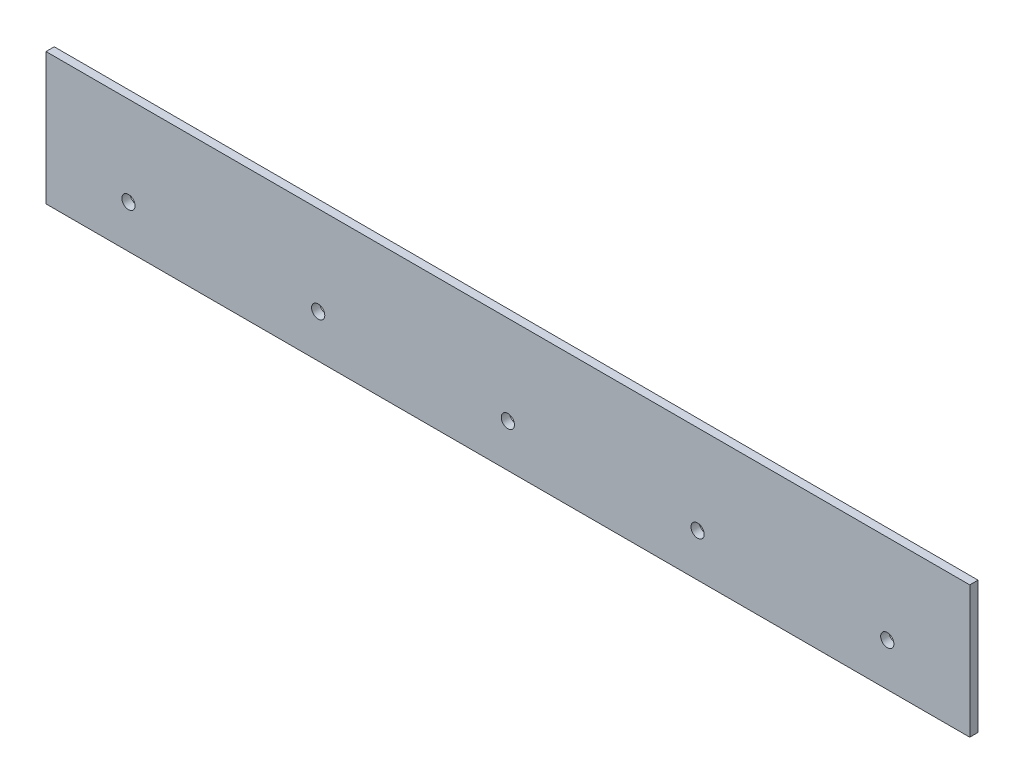
ISO-10303-21;
HEADER;
FILE_DESCRIPTION(('STEP AP214'),'2;1');
FILE_NAME('part.step','',(''),(''),'','','');
FILE_SCHEMA(('AUTOMOTIVE_DESIGN { 1 0 10303 214 1 1 1 1 }'));
ENDSEC;
DATA;
#1=APPLICATION_CONTEXT('core data for automotive mechanical design processes');
#2=APPLICATION_PROTOCOL_DEFINITION('international standard','automotive_design',2000,#1);
#3=PRODUCT_CONTEXT('',#1,'mechanical');
#4=PRODUCT('Part','Part','',(#3));
#5=PRODUCT_RELATED_PRODUCT_CATEGORY('part','',(#4));
#6=PRODUCT_DEFINITION_FORMATION('','',#4);
#7=PRODUCT_DEFINITION_CONTEXT('part definition',#1,'design');
#8=PRODUCT_DEFINITION('design','',#6,#7);
#9=PRODUCT_DEFINITION_SHAPE('','',#8);
#10=(LENGTH_UNIT() NAMED_UNIT(*) SI_UNIT(.MILLI.,.METRE.));
#11=(NAMED_UNIT(*) PLANE_ANGLE_UNIT() SI_UNIT($,.RADIAN.));
#12=(NAMED_UNIT(*) SI_UNIT($,.STERADIAN.) SOLID_ANGLE_UNIT());
#13=UNCERTAINTY_MEASURE_WITH_UNIT(LENGTH_MEASURE(1.E-05),#10,'distance_accuracy_value','');
#14=(GEOMETRIC_REPRESENTATION_CONTEXT(3) GLOBAL_UNCERTAINTY_ASSIGNED_CONTEXT((#13)) GLOBAL_UNIT_ASSIGNED_CONTEXT((#10,
#11,#12)) REPRESENTATION_CONTEXT('',''));
#15=CARTESIAN_POINT('',(0.,0.,0.));
#16=DIRECTION('',(0.,0.,1.));
#17=DIRECTION('',(1.,0.,0.));
#18=AXIS2_PLACEMENT_3D('',#15,#16,#17);
#19=CARTESIAN_POINT('',(0.,0.,3.175));
#20=DIRECTION('',(0.,0.,-1.));
#21=DIRECTION('',(-1.,0.,0.));
#22=AXIS2_PLACEMENT_3D('',#19,#20,#21);
#23=PLANE('',#22);
#24=DIRECTION('',(0.,-1.,0.));
#25=VECTOR('',#24,1.);
#26=CARTESIAN_POINT('',(-177.8,-25.4,3.175));
#27=LINE('',#26,#25);
#28=CARTESIAN_POINT('',(-177.8,25.4,3.175));
#29=VERTEX_POINT('',#28);
#30=CARTESIAN_POINT('',(-177.8,-25.4,3.175));
#31=VERTEX_POINT('',#30);
#32=EDGE_CURVE('E89',#29,#31,#27,.T.);
#33=ORIENTED_EDGE('',*,*,#32,.T.);
#34=DIRECTION('',(1.,0.,0.));
#35=VECTOR('',#34,1.);
#36=CARTESIAN_POINT('',(-177.8,-25.4,3.175));
#37=LINE('',#36,#35);
#38=CARTESIAN_POINT('',(177.8,-25.4,3.175));
#39=VERTEX_POINT('',#38);
#40=EDGE_CURVE('E84',#31,#39,#37,.T.);
#41=ORIENTED_EDGE('',*,*,#40,.T.);
#42=DIRECTION('',(0.,1.,0.));
#43=VECTOR('',#42,1.);
#44=CARTESIAN_POINT('',(177.8,-25.4,3.175));
#45=LINE('',#44,#43);
#46=CARTESIAN_POINT('',(177.8,25.4,3.175));
#47=VERTEX_POINT('',#46);
#48=EDGE_CURVE('E87',#39,#47,#45,.T.);
#49=ORIENTED_EDGE('',*,*,#48,.T.);
#50=DIRECTION('',(-1.,0.,0.));
#51=VECTOR('',#50,1.);
#52=CARTESIAN_POINT('',(-177.8,25.4,3.175));
#53=LINE('',#52,#51);
#54=EDGE_CURVE('E54',#47,#29,#53,.T.);
#55=ORIENTED_EDGE('',*,*,#54,.T.);
#56=EDGE_LOOP('',(#33,#41,#49,#55));
#57=FACE_BOUND('',#56,.T.);
#58=CARTESIAN_POINT('',(0.,-8.89,3.175));
#59=DIRECTION('',(0.,0.,1.));
#60=DIRECTION('',(1.,0.,0.));
#61=AXIS2_PLACEMENT_3D('',#58,#59,#60);
#62=CIRCLE('',#61,2.54);
#63=CARTESIAN_POINT('',(2.54,-8.89,3.175));
#64=VERTEX_POINT('',#63);
#65=EDGE_CURVE('E105',#64,#64,#62,.T.);
#66=ORIENTED_EDGE('',*,*,#65,.F.);
#67=EDGE_LOOP('',(#66));
#68=FACE_BOUND('',#67,.T.);
#69=CARTESIAN_POINT('',(-146.05,-8.89,3.175));
#70=DIRECTION('',(0.,0.,1.));
#71=DIRECTION('',(1.,0.,0.));
#72=AXIS2_PLACEMENT_3D('',#69,#70,#71);
#73=CIRCLE('',#72,2.53999999999998);
#74=CARTESIAN_POINT('',(-143.51,-8.89,3.175));
#75=VERTEX_POINT('',#74);
#76=EDGE_CURVE('E121',#75,#75,#73,.T.);
#77=ORIENTED_EDGE('',*,*,#76,.F.);
#78=EDGE_LOOP('',(#77));
#79=FACE_BOUND('',#78,.T.);
#80=CARTESIAN_POINT('',(-73.025,-8.89,3.175));
#81=DIRECTION('',(0.,0.,1.));
#82=DIRECTION('',(1.,0.,0.));
#83=AXIS2_PLACEMENT_3D('',#80,#81,#82);
#84=CIRCLE('',#83,2.54);
#85=CARTESIAN_POINT('',(-70.485,-8.89,3.175));
#86=VERTEX_POINT('',#85);
#87=EDGE_CURVE('E127',#86,#86,#84,.T.);
#88=ORIENTED_EDGE('',*,*,#87,.F.);
#89=EDGE_LOOP('',(#88));
#90=FACE_BOUND('',#89,.T.);
#91=CARTESIAN_POINT('',(73.025,-8.89,3.175));
#92=DIRECTION('',(0.,0.,1.));
#93=DIRECTION('',(-1.,0.,0.));
#94=AXIS2_PLACEMENT_3D('',#91,#92,#93);
#95=CIRCLE('',#94,2.54);
#96=CARTESIAN_POINT('',(70.485,-8.89,3.175));
#97=VERTEX_POINT('',#96);
#98=EDGE_CURVE('E133',#97,#97,#95,.T.);
#99=ORIENTED_EDGE('',*,*,#98,.F.);
#100=EDGE_LOOP('',(#99));
#101=FACE_BOUND('',#100,.T.);
#102=CARTESIAN_POINT('',(146.05,-8.89,3.175));
#103=DIRECTION('',(0.,0.,1.));
#104=DIRECTION('',(-1.,0.,0.));
#105=AXIS2_PLACEMENT_3D('',#102,#103,#104);
#106=CIRCLE('',#105,2.53999999999998);
#107=CARTESIAN_POINT('',(143.51,-8.89,3.175));
#108=VERTEX_POINT('',#107);
#109=EDGE_CURVE('E139',#108,#108,#106,.T.);
#110=ORIENTED_EDGE('',*,*,#109,.F.);
#111=EDGE_LOOP('',(#110));
#112=FACE_BOUND('',#111,.T.);
#113=ADVANCED_FACE('F37',(#57,#68,#79,#90,#101,#112),#23,.F.);
#114=CARTESIAN_POINT('',(0.,0.,0.));
#115=DIRECTION('',(0.,0.,-1.));
#116=DIRECTION('',(-1.,0.,0.));
#117=AXIS2_PLACEMENT_3D('',#114,#115,#116);
#118=PLANE('',#117);
#119=CARTESIAN_POINT('',(73.025,-8.89,0.));
#120=DIRECTION('',(0.,0.,1.));
#121=DIRECTION('',(-1.,0.,0.));
#122=AXIS2_PLACEMENT_3D('',#119,#120,#121);
#123=CIRCLE('',#122,2.54);
#124=CARTESIAN_POINT('',(70.485,-8.89,0.));
#125=VERTEX_POINT('',#124);
#126=EDGE_CURVE('E136',#125,#125,#123,.T.);
#127=ORIENTED_EDGE('',*,*,#126,.T.);
#128=EDGE_LOOP('',(#127));
#129=FACE_BOUND('',#128,.T.);
#130=CARTESIAN_POINT('',(-146.05,-8.89,0.));
#131=DIRECTION('',(0.,0.,1.));
#132=DIRECTION('',(1.,0.,0.));
#133=AXIS2_PLACEMENT_3D('',#130,#131,#132);
#134=CIRCLE('',#133,2.53999999999998);
#135=CARTESIAN_POINT('',(-143.51,-8.89,0.));
#136=VERTEX_POINT('',#135);
#137=EDGE_CURVE('E124',#136,#136,#134,.T.);
#138=ORIENTED_EDGE('',*,*,#137,.T.);
#139=EDGE_LOOP('',(#138));
#140=FACE_BOUND('',#139,.T.);
#141=DIRECTION('',(0.,-1.,0.));
#142=VECTOR('',#141,1.);
#143=CARTESIAN_POINT('',(-177.8,-25.4,0.));
#144=LINE('',#143,#142);
#145=CARTESIAN_POINT('',(-177.8,25.4,0.));
#146=VERTEX_POINT('',#145);
#147=CARTESIAN_POINT('',(-177.8,-25.4,0.));
#148=VERTEX_POINT('',#147);
#149=EDGE_CURVE('E102',#146,#148,#144,.T.);
#150=ORIENTED_EDGE('',*,*,#149,.F.);
#151=DIRECTION('',(-1.,0.,0.));
#152=VECTOR('',#151,1.);
#153=CARTESIAN_POINT('',(-177.8,25.4,0.));
#154=LINE('',#153,#152);
#155=CARTESIAN_POINT('',(177.8,25.4,0.));
#156=VERTEX_POINT('',#155);
#157=EDGE_CURVE('E77',#156,#146,#154,.T.);
#158=ORIENTED_EDGE('',*,*,#157,.F.);
#159=DIRECTION('',(0.,1.,0.));
#160=VECTOR('',#159,1.);
#161=CARTESIAN_POINT('',(177.8,-25.4,0.));
#162=LINE('',#161,#160);
#163=CARTESIAN_POINT('',(177.8,-25.4,0.));
#164=VERTEX_POINT('',#163);
#165=EDGE_CURVE('E71',#164,#156,#162,.T.);
#166=ORIENTED_EDGE('',*,*,#165,.F.);
#167=DIRECTION('',(1.,0.,0.));
#168=VECTOR('',#167,1.);
#169=CARTESIAN_POINT('',(-177.8,-25.4,0.));
#170=LINE('',#169,#168);
#171=EDGE_CURVE('E93',#148,#164,#170,.T.);
#172=ORIENTED_EDGE('',*,*,#171,.F.);
#173=EDGE_LOOP('',(#150,#158,#166,#172));
#174=FACE_BOUND('',#173,.T.);
#175=CARTESIAN_POINT('',(0.,-8.89,0.));
#176=DIRECTION('',(0.,0.,1.));
#177=DIRECTION('',(1.,0.,0.));
#178=AXIS2_PLACEMENT_3D('',#175,#176,#177);
#179=CIRCLE('',#178,2.54);
#180=CARTESIAN_POINT('',(2.54,-8.89,0.));
#181=VERTEX_POINT('',#180);
#182=EDGE_CURVE('E118',#181,#181,#179,.T.);
#183=ORIENTED_EDGE('',*,*,#182,.T.);
#184=EDGE_LOOP('',(#183));
#185=FACE_BOUND('',#184,.T.);
#186=CARTESIAN_POINT('',(-73.025,-8.89,0.));
#187=DIRECTION('',(0.,0.,1.));
#188=DIRECTION('',(1.,0.,0.));
#189=AXIS2_PLACEMENT_3D('',#186,#187,#188);
#190=CIRCLE('',#189,2.54);
#191=CARTESIAN_POINT('',(-70.485,-8.89,0.));
#192=VERTEX_POINT('',#191);
#193=EDGE_CURVE('E130',#192,#192,#190,.T.);
#194=ORIENTED_EDGE('',*,*,#193,.T.);
#195=EDGE_LOOP('',(#194));
#196=FACE_BOUND('',#195,.T.);
#197=CARTESIAN_POINT('',(146.05,-8.89,0.));
#198=DIRECTION('',(0.,0.,1.));
#199=DIRECTION('',(-1.,0.,0.));
#200=AXIS2_PLACEMENT_3D('',#197,#198,#199);
#201=CIRCLE('',#200,2.53999999999998);
#202=CARTESIAN_POINT('',(143.51,-8.89,0.));
#203=VERTEX_POINT('',#202);
#204=EDGE_CURVE('E142',#203,#203,#201,.T.);
#205=ORIENTED_EDGE('',*,*,#204,.T.);
#206=EDGE_LOOP('',(#205));
#207=FACE_BOUND('',#206,.T.);
#208=ADVANCED_FACE('F114',(#129,#140,#174,#185,#196,#207),#118,.T.);
#209=CARTESIAN_POINT('',(-177.8,-25.4,3.175));
#210=DIRECTION('',(1.,0.,0.));
#211=DIRECTION('',(0.,0.,-1.));
#212=AXIS2_PLACEMENT_3D('',#209,#210,#211);
#213=PLANE('',#212);
#214=ORIENTED_EDGE('',*,*,#149,.T.);
#215=DIRECTION('',(0.,0.,-1.));
#216=VECTOR('',#215,1.);
#217=CARTESIAN_POINT('',(-177.8,-25.4,3.175));
#218=LINE('',#217,#216);
#219=EDGE_CURVE('E11',#31,#148,#218,.T.);
#220=ORIENTED_EDGE('',*,*,#219,.F.);
#221=ORIENTED_EDGE('',*,*,#32,.F.);
#222=DIRECTION('',(0.,0.,-1.));
#223=VECTOR('',#222,1.);
#224=CARTESIAN_POINT('',(-177.8,25.4,3.175));
#225=LINE('',#224,#223);
#226=EDGE_CURVE('E98',#29,#146,#225,.T.);
#227=ORIENTED_EDGE('',*,*,#226,.T.);
#228=EDGE_LOOP('',(#214,#220,#221,#227));
#229=FACE_BOUND('',#228,.T.);
#230=ADVANCED_FACE('F39',(#229),#213,.F.);
#231=CARTESIAN_POINT('',(-177.8,-25.4,3.175));
#232=DIRECTION('',(0.,1.,0.));
#233=DIRECTION('',(0.,0.,1.));
#234=AXIS2_PLACEMENT_3D('',#231,#232,#233);
#235=PLANE('',#234);
#236=ORIENTED_EDGE('',*,*,#171,.T.);
#237=DIRECTION('',(0.,0.,-1.));
#238=VECTOR('',#237,1.);
#239=CARTESIAN_POINT('',(177.8,-25.4,3.175));
#240=LINE('',#239,#238);
#241=EDGE_CURVE('E46',#39,#164,#240,.T.);
#242=ORIENTED_EDGE('',*,*,#241,.F.);
#243=ORIENTED_EDGE('',*,*,#40,.F.);
#244=ORIENTED_EDGE('',*,*,#219,.T.);
#245=EDGE_LOOP('',(#236,#242,#243,#244));
#246=FACE_BOUND('',#245,.T.);
#247=ADVANCED_FACE('F92',(#246),#235,.F.);
#248=CARTESIAN_POINT('',(177.8,-25.4,3.175));
#249=DIRECTION('',(-1.,0.,0.));
#250=DIRECTION('',(0.,0.,1.));
#251=AXIS2_PLACEMENT_3D('',#248,#249,#250);
#252=PLANE('',#251);
#253=ORIENTED_EDGE('',*,*,#165,.T.);
#254=DIRECTION('',(0.,0.,-1.));
#255=VECTOR('',#254,1.);
#256=CARTESIAN_POINT('',(177.8,25.4,3.175));
#257=LINE('',#256,#255);
#258=EDGE_CURVE('E94',#47,#156,#257,.T.);
#259=ORIENTED_EDGE('',*,*,#258,.F.);
#260=ORIENTED_EDGE('',*,*,#48,.F.);
#261=ORIENTED_EDGE('',*,*,#241,.T.);
#262=EDGE_LOOP('',(#253,#259,#260,#261));
#263=FACE_BOUND('',#262,.T.);
#264=ADVANCED_FACE('F95',(#263),#252,.F.);
#265=CARTESIAN_POINT('',(-177.8,25.4,3.175));
#266=DIRECTION('',(0.,-1.,0.));
#267=DIRECTION('',(0.,0.,-1.));
#268=AXIS2_PLACEMENT_3D('',#265,#266,#267);
#269=PLANE('',#268);
#270=ORIENTED_EDGE('',*,*,#157,.T.);
#271=ORIENTED_EDGE('',*,*,#226,.F.);
#272=ORIENTED_EDGE('',*,*,#54,.F.);
#273=ORIENTED_EDGE('',*,*,#258,.T.);
#274=EDGE_LOOP('',(#270,#271,#272,#273));
#275=FACE_BOUND('',#274,.T.);
#276=ADVANCED_FACE('F111',(#275),#269,.F.);
#277=CARTESIAN_POINT('',(0.,-8.89,3.175));
#278=DIRECTION('',(0.,0.,-1.));
#279=DIRECTION('',(-1.,0.,0.));
#280=AXIS2_PLACEMENT_3D('',#277,#278,#279);
#281=CYLINDRICAL_SURFACE('',#280,2.54);
#282=ORIENTED_EDGE('',*,*,#65,.T.);
#283=EDGE_LOOP('',(#282));
#284=FACE_BOUND('',#283,.T.);
#285=ORIENTED_EDGE('',*,*,#182,.F.);
#286=EDGE_LOOP('',(#285));
#287=FACE_BOUND('',#286,.T.);
#288=ADVANCED_FACE('F159',(#284,#287),#281,.F.);
#289=CARTESIAN_POINT('',(-146.05,-8.89,3.175));
#290=DIRECTION('',(0.,0.,-1.));
#291=DIRECTION('',(-1.,0.,0.));
#292=AXIS2_PLACEMENT_3D('',#289,#290,#291);
#293=CYLINDRICAL_SURFACE('',#292,2.53999999999998);
#294=ORIENTED_EDGE('',*,*,#76,.T.);
#295=EDGE_LOOP('',(#294));
#296=FACE_BOUND('',#295,.T.);
#297=ORIENTED_EDGE('',*,*,#137,.F.);
#298=EDGE_LOOP('',(#297));
#299=FACE_BOUND('',#298,.T.);
#300=ADVANCED_FACE('F207',(#296,#299),#293,.F.);
#301=CARTESIAN_POINT('',(-73.025,-8.89,3.175));
#302=DIRECTION('',(0.,0.,-1.));
#303=DIRECTION('',(-1.,0.,0.));
#304=AXIS2_PLACEMENT_3D('',#301,#302,#303);
#305=CYLINDRICAL_SURFACE('',#304,2.54);
#306=ORIENTED_EDGE('',*,*,#87,.T.);
#307=EDGE_LOOP('',(#306));
#308=FACE_BOUND('',#307,.T.);
#309=ORIENTED_EDGE('',*,*,#193,.F.);
#310=EDGE_LOOP('',(#309));
#311=FACE_BOUND('',#310,.T.);
#312=ADVANCED_FACE('F215',(#308,#311),#305,.F.);
#313=CARTESIAN_POINT('',(73.025,-8.89,3.175));
#314=DIRECTION('',(0.,0.,-1.));
#315=DIRECTION('',(-1.,0.,0.));
#316=AXIS2_PLACEMENT_3D('',#313,#314,#315);
#317=CYLINDRICAL_SURFACE('',#316,2.54);
#318=ORIENTED_EDGE('',*,*,#98,.T.);
#319=EDGE_LOOP('',(#318));
#320=FACE_BOUND('',#319,.T.);
#321=ORIENTED_EDGE('',*,*,#126,.F.);
#322=EDGE_LOOP('',(#321));
#323=FACE_BOUND('',#322,.T.);
#324=ADVANCED_FACE('F223',(#320,#323),#317,.F.);
#325=CARTESIAN_POINT('',(146.05,-8.89,3.175));
#326=DIRECTION('',(0.,0.,-1.));
#327=DIRECTION('',(-1.,0.,0.));
#328=AXIS2_PLACEMENT_3D('',#325,#326,#327);
#329=CYLINDRICAL_SURFACE('',#328,2.53999999999998);
#330=ORIENTED_EDGE('',*,*,#109,.T.);
#331=EDGE_LOOP('',(#330));
#332=FACE_BOUND('',#331,.T.);
#333=ORIENTED_EDGE('',*,*,#204,.F.);
#334=EDGE_LOOP('',(#333));
#335=FACE_BOUND('',#334,.T.);
#336=ADVANCED_FACE('F148',(#332,#335),#329,.F.);
#337=CLOSED_SHELL('',(#113,#208,#230,#247,#264,#276,#288,#300,#312,#324,#336));
#338=MANIFOLD_SOLID_BREP('B2',#337);
#339=ADVANCED_BREP_SHAPE_REPRESENTATION('',(#18,#338),#14);
#340=SHAPE_DEFINITION_REPRESENTATION(#9,#339);
ENDSEC;
END-ISO-10303-21;
